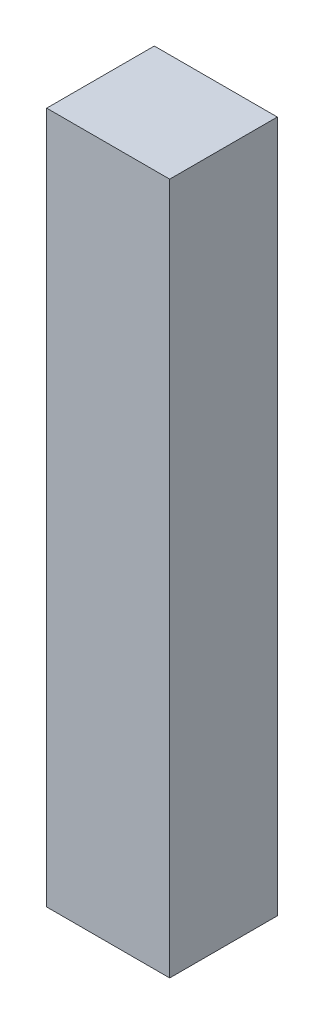
ISO-10303-21;
HEADER;
FILE_DESCRIPTION(('STEP AP214'),'2;1');
FILE_NAME('part.step','',(''),(''),'','','');
FILE_SCHEMA(('AUTOMOTIVE_DESIGN { 1 0 10303 214 1 1 1 1 }'));
ENDSEC;
DATA;
#1=APPLICATION_CONTEXT('core data for automotive mechanical design processes');
#2=APPLICATION_PROTOCOL_DEFINITION('international standard','automotive_design',2000,#1);
#3=PRODUCT_CONTEXT('',#1,'mechanical');
#4=PRODUCT('Part','Part','',(#3));
#5=PRODUCT_RELATED_PRODUCT_CATEGORY('part','',(#4));
#6=PRODUCT_DEFINITION_FORMATION('','',#4);
#7=PRODUCT_DEFINITION_CONTEXT('part definition',#1,'design');
#8=PRODUCT_DEFINITION('design','',#6,#7);
#9=PRODUCT_DEFINITION_SHAPE('','',#8);
#10=(LENGTH_UNIT() NAMED_UNIT(*) SI_UNIT(.MILLI.,.METRE.));
#11=(NAMED_UNIT(*) PLANE_ANGLE_UNIT() SI_UNIT($,.RADIAN.));
#12=(NAMED_UNIT(*) SI_UNIT($,.STERADIAN.) SOLID_ANGLE_UNIT());
#13=UNCERTAINTY_MEASURE_WITH_UNIT(LENGTH_MEASURE(1.E-05),#10,'distance_accuracy_value','');
#14=(GEOMETRIC_REPRESENTATION_CONTEXT(3) GLOBAL_UNCERTAINTY_ASSIGNED_CONTEXT((#13)) GLOBAL_UNIT_ASSIGNED_CONTEXT((#10,
#11,#12)) REPRESENTATION_CONTEXT('',''));
#15=CARTESIAN_POINT('',(0.,0.,0.));
#16=DIRECTION('',(0.,0.,1.));
#17=DIRECTION('',(1.,0.,0.));
#18=AXIS2_PLACEMENT_3D('',#15,#16,#17);
#19=CARTESIAN_POINT('',(0.,45.,0.));
#20=DIRECTION('',(1.,0.,0.));
#21=DIRECTION('',(0.,0.,-1.));
#22=AXIS2_PLACEMENT_3D('',#19,#20,#21);
#23=PLANE('',#22);
#24=DIRECTION('',(0.,0.,1.));
#25=VECTOR('',#24,1.);
#26=CARTESIAN_POINT('',(0.,0.,0.));
#27=LINE('',#26,#25);
#28=CARTESIAN_POINT('',(0.,0.,-7.));
#29=VERTEX_POINT('',#28);
#30=CARTESIAN_POINT('',(0.,0.,0.));
#31=VERTEX_POINT('',#30);
#32=EDGE_CURVE('E107',#29,#31,#27,.T.);
#33=ORIENTED_EDGE('',*,*,#32,.T.);
#34=DIRECTION('',(0.,-1.,0.));
#35=VECTOR('',#34,1.);
#36=CARTESIAN_POINT('',(0.,45.,0.));
#37=LINE('',#36,#35);
#38=CARTESIAN_POINT('',(0.,45.,0.));
#39=VERTEX_POINT('',#38);
#40=EDGE_CURVE('E11',#39,#31,#37,.T.);
#41=ORIENTED_EDGE('',*,*,#40,.F.);
#42=DIRECTION('',(0.,0.,1.));
#43=VECTOR('',#42,1.);
#44=CARTESIAN_POINT('',(0.,45.,0.));
#45=LINE('',#44,#43);
#46=CARTESIAN_POINT('',(0.,45.,-7.));
#47=VERTEX_POINT('',#46);
#48=EDGE_CURVE('E91',#47,#39,#45,.T.);
#49=ORIENTED_EDGE('',*,*,#48,.F.);
#50=DIRECTION('',(0.,-1.,0.));
#51=VECTOR('',#50,1.);
#52=CARTESIAN_POINT('',(0.,45.,-7.));
#53=LINE('',#52,#51);
#54=EDGE_CURVE('E103',#47,#29,#53,.T.);
#55=ORIENTED_EDGE('',*,*,#54,.T.);
#56=EDGE_LOOP('',(#33,#41,#49,#55));
#57=FACE_BOUND('',#56,.T.);
#58=ADVANCED_FACE('F39',(#57),#23,.F.);
#59=CARTESIAN_POINT('',(0.,45.,0.));
#60=DIRECTION('',(0.,0.,-1.));
#61=DIRECTION('',(-1.,0.,0.));
#62=AXIS2_PLACEMENT_3D('',#59,#60,#61);
#63=PLANE('',#62);
#64=DIRECTION('',(1.,0.,0.));
#65=VECTOR('',#64,1.);
#66=CARTESIAN_POINT('',(0.,0.,0.));
#67=LINE('',#66,#65);
#68=CARTESIAN_POINT('',(8.,0.,0.));
#69=VERTEX_POINT('',#68);
#70=EDGE_CURVE('E96',#31,#69,#67,.T.);
#71=ORIENTED_EDGE('',*,*,#70,.T.);
#72=DIRECTION('',(0.,-1.,0.));
#73=VECTOR('',#72,1.);
#74=CARTESIAN_POINT('',(8.,45.,0.));
#75=LINE('',#74,#73);
#76=CARTESIAN_POINT('',(8.,45.,0.));
#77=VERTEX_POINT('',#76);
#78=EDGE_CURVE('E48',#77,#69,#75,.T.);
#79=ORIENTED_EDGE('',*,*,#78,.F.);
#80=DIRECTION('',(1.,0.,0.));
#81=VECTOR('',#80,1.);
#82=CARTESIAN_POINT('',(0.,45.,0.));
#83=LINE('',#82,#81);
#84=EDGE_CURVE('E86',#39,#77,#83,.T.);
#85=ORIENTED_EDGE('',*,*,#84,.F.);
#86=ORIENTED_EDGE('',*,*,#40,.T.);
#87=EDGE_LOOP('',(#71,#79,#85,#86));
#88=FACE_BOUND('',#87,.T.);
#89=ADVANCED_FACE('F95',(#88),#63,.F.);
#90=CARTESIAN_POINT('',(8.,45.,0.));
#91=DIRECTION('',(-1.,0.,0.));
#92=DIRECTION('',(0.,0.,1.));
#93=AXIS2_PLACEMENT_3D('',#90,#91,#92);
#94=PLANE('',#93);
#95=DIRECTION('',(0.,0.,-1.));
#96=VECTOR('',#95,1.);
#97=CARTESIAN_POINT('',(8.,0.,0.));
#98=LINE('',#97,#96);
#99=CARTESIAN_POINT('',(8.,0.,-7.));
#100=VERTEX_POINT('',#99);
#101=EDGE_CURVE('E73',#69,#100,#98,.T.);
#102=ORIENTED_EDGE('',*,*,#101,.T.);
#103=DIRECTION('',(0.,-1.,0.));
#104=VECTOR('',#103,1.);
#105=CARTESIAN_POINT('',(8.,45.,-7.));
#106=LINE('',#105,#104);
#107=CARTESIAN_POINT('',(8.,45.,-7.));
#108=VERTEX_POINT('',#107);
#109=EDGE_CURVE('E98',#108,#100,#106,.T.);
#110=ORIENTED_EDGE('',*,*,#109,.F.);
#111=DIRECTION('',(0.,0.,-1.));
#112=VECTOR('',#111,1.);
#113=CARTESIAN_POINT('',(8.,45.,0.));
#114=LINE('',#113,#112);
#115=EDGE_CURVE('E89',#77,#108,#114,.T.);
#116=ORIENTED_EDGE('',*,*,#115,.F.);
#117=ORIENTED_EDGE('',*,*,#78,.T.);
#118=EDGE_LOOP('',(#102,#110,#116,#117));
#119=FACE_BOUND('',#118,.T.);
#120=ADVANCED_FACE('F99',(#119),#94,.F.);
#121=CARTESIAN_POINT('',(0.,45.,-7.));
#122=DIRECTION('',(0.,0.,1.));
#123=DIRECTION('',(1.,0.,0.));
#124=AXIS2_PLACEMENT_3D('',#121,#122,#123);
#125=PLANE('',#124);
#126=DIRECTION('',(-1.,0.,0.));
#127=VECTOR('',#126,1.);
#128=CARTESIAN_POINT('',(0.,0.,-7.));
#129=LINE('',#128,#127);
#130=EDGE_CURVE('E79',#100,#29,#129,.T.);
#131=ORIENTED_EDGE('',*,*,#130,.T.);
#132=ORIENTED_EDGE('',*,*,#54,.F.);
#133=DIRECTION('',(-1.,0.,0.));
#134=VECTOR('',#133,1.);
#135=CARTESIAN_POINT('',(0.,45.,-7.));
#136=LINE('',#135,#134);
#137=EDGE_CURVE('E56',#108,#47,#136,.T.);
#138=ORIENTED_EDGE('',*,*,#137,.F.);
#139=ORIENTED_EDGE('',*,*,#109,.T.);
#140=EDGE_LOOP('',(#131,#132,#138,#139));
#141=FACE_BOUND('',#140,.T.);
#142=ADVANCED_FACE('F120',(#141),#125,.F.);
#143=CARTESIAN_POINT('',(0.,45.,0.));
#144=DIRECTION('',(0.,-1.,0.));
#145=DIRECTION('',(0.,0.,-1.));
#146=AXIS2_PLACEMENT_3D('',#143,#144,#145);
#147=PLANE('',#146);
#148=ORIENTED_EDGE('',*,*,#48,.T.);
#149=ORIENTED_EDGE('',*,*,#84,.T.);
#150=ORIENTED_EDGE('',*,*,#115,.T.);
#151=ORIENTED_EDGE('',*,*,#137,.T.);
#152=EDGE_LOOP('',(#148,#149,#150,#151));
#153=FACE_BOUND('',#152,.T.);
#154=ADVANCED_FACE('F87',(#153),#147,.F.);
#155=CARTESIAN_POINT('',(0.,0.,0.));
#156=DIRECTION('',(0.,-1.,0.));
#157=DIRECTION('',(0.,0.,-1.));
#158=AXIS2_PLACEMENT_3D('',#155,#156,#157);
#159=PLANE('',#158);
#160=ORIENTED_EDGE('',*,*,#32,.F.);
#161=ORIENTED_EDGE('',*,*,#130,.F.);
#162=ORIENTED_EDGE('',*,*,#101,.F.);
#163=ORIENTED_EDGE('',*,*,#70,.F.);
#164=EDGE_LOOP('',(#160,#161,#162,#163));
#165=FACE_BOUND('',#164,.T.);
#166=ADVANCED_FACE('F123',(#165),#159,.T.);
#167=CLOSED_SHELL('',(#58,#89,#120,#142,#154,#166));
#168=MANIFOLD_SOLID_BREP('B2',#167);
#169=ADVANCED_BREP_SHAPE_REPRESENTATION('',(#18,#168),#14);
#170=SHAPE_DEFINITION_REPRESENTATION(#9,#169);
ENDSEC;
END-ISO-10303-21;
